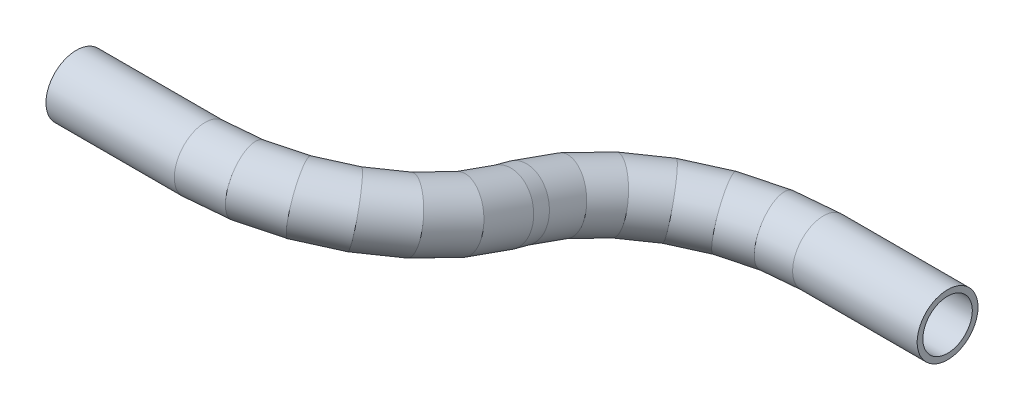
ISO-10303-21;
HEADER;
FILE_DESCRIPTION(('STEP AP214'),'2;1');
FILE_NAME('part.step','',(''),(''),'','','');
FILE_SCHEMA(('AUTOMOTIVE_DESIGN { 1 0 10303 214 1 1 1 1 }'));
ENDSEC;
DATA;
#1=APPLICATION_CONTEXT('core data for automotive mechanical design processes');
#2=APPLICATION_PROTOCOL_DEFINITION('international standard','automotive_design',2000,#1);
#3=PRODUCT_CONTEXT('',#1,'mechanical');
#4=PRODUCT('Part','Part','',(#3));
#5=PRODUCT_RELATED_PRODUCT_CATEGORY('part','',(#4));
#6=PRODUCT_DEFINITION_FORMATION('','',#4);
#7=PRODUCT_DEFINITION_CONTEXT('part definition',#1,'design');
#8=PRODUCT_DEFINITION('design','',#6,#7);
#9=PRODUCT_DEFINITION_SHAPE('','',#8);
#10=(LENGTH_UNIT() NAMED_UNIT(*) SI_UNIT(.MILLI.,.METRE.));
#11=(NAMED_UNIT(*) PLANE_ANGLE_UNIT() SI_UNIT($,.RADIAN.));
#12=(NAMED_UNIT(*) SI_UNIT($,.STERADIAN.) SOLID_ANGLE_UNIT());
#13=UNCERTAINTY_MEASURE_WITH_UNIT(LENGTH_MEASURE(1.E-05),#10,'distance_accuracy_value','');
#14=(GEOMETRIC_REPRESENTATION_CONTEXT(3) GLOBAL_UNCERTAINTY_ASSIGNED_CONTEXT((#13)) GLOBAL_UNIT_ASSIGNED_CONTEXT((#10,
#11,#12)) REPRESENTATION_CONTEXT('',''));
#15=CARTESIAN_POINT('',(0.,0.,0.));
#16=DIRECTION('',(0.,0.,1.));
#17=DIRECTION('',(1.,0.,0.));
#18=AXIS2_PLACEMENT_3D('',#15,#16,#17);
#19=CARTESIAN_POINT('',(-2251.19736561347,-22.4007883536229,-83.6008802653181));
#20=DIRECTION('',(1.,0.,0.));
#21=DIRECTION('',(0.,0.,-1.));
#22=AXIS2_PLACEMENT_3D('',#19,#20,#21);
#23=CYLINDRICAL_SURFACE('',#22,4.7625);
#24=CARTESIAN_POINT('',(-2250.58796047896,-22.4007883536228,-83.6008802653177));
#25=DIRECTION('',(0.997858923238603,-0.0169275754540626,-0.0631745716435174));
#26=DIRECTION('',(-0.0654031292301438,-0.258264893659644,-0.963857704949168));
#27=AXIS2_PLACEMENT_3D('',#24,#25,#26);
#28=ELLIPSE('',#27,4.77271875721977,4.7625);
#29=CARTESIAN_POINT('',(-2250.90011122062,-23.6334140559236,-88.2011020130194));
#30=VERTEX_POINT('',#29);
#31=EDGE_CURVE('E45',#30,#30,#28,.F.);
#32=ORIENTED_EDGE('',*,*,#31,.F.);
#33=EDGE_LOOP('',(#32));
#34=FACE_BOUND('',#33,.T.);
#35=CARTESIAN_POINT('',(-2230.78796047896,-22.4007883536229,-83.6008802653181));
#36=DIRECTION('',(1.,0.,0.));
#37=DIRECTION('',(0.,0.,-1.));
#38=AXIS2_PLACEMENT_3D('',#35,#36,#37);
#39=CIRCLE('',#38,4.7625);
#40=CARTESIAN_POINT('',(-2230.78796047896,-22.4007883536229,-88.3633802653181));
#41=VERTEX_POINT('',#40);
#42=EDGE_CURVE('E98',#41,#41,#39,.T.);
#43=ORIENTED_EDGE('',*,*,#42,.F.);
#44=EDGE_LOOP('',(#43));
#45=FACE_BOUND('',#44,.T.);
#46=ADVANCED_FACE('F39',(#34,#45),#23,.T.);
#47=CARTESIAN_POINT('',(-2257.91321428504,-22.1511863829578,-82.6693530291264));
#48=DIRECTION('',(0.99144486137381,-0.0337826644312621,-0.126078620072521));
#49=DIRECTION('',(-0.126150626485885,0.,-0.992011098444578));
#50=AXIS2_PLACEMENT_3D('',#47,#48,#49);
#51=CYLINDRICAL_SURFACE('',#50,4.7625);
#52=CARTESIAN_POINT('',(-2256.79961756142,-22.1891312711623,-82.8109652797932));
#53=DIRECTION('',(0.965925826289069,-0.0669872981077804,-0.249999999999999));
#54=DIRECTION('',(-0.25881904510252,-0.250000000000001,-0.93301270189222));
#55=AXIS2_PLACEMENT_3D('',#52,#53,#54);
#56=ELLIPSE('',#55,4.80359542476298,4.7625);
#57=CARTESIAN_POINT('',(-2258.04287954231,-23.3900301273531,-87.2927808258484));
#58=VERTEX_POINT('',#57);
#59=EDGE_CURVE('E136',#58,#58,#56,.F.);
#60=ORIENTED_EDGE('',*,*,#59,.F.);
#61=EDGE_LOOP('',(#60));
#62=FACE_BOUND('',#61,.T.);
#63=ORIENTED_EDGE('',*,*,#31,.T.);
#64=EDGE_LOOP('',(#63));
#65=FACE_BOUND('',#64,.T.);
#66=ADVANCED_FACE('F141',(#62,#65),#51,.T.);
#67=CARTESIAN_POINT('',(-2263.62566742617,-21.4573353209812,-80.0798656129441));
#68=DIRECTION('',(0.923879532511288,-0.0990457605412868,-0.369643810614382));
#69=DIRECTION('',(-0.371470375165562,0.,-0.92844480739264));
#70=AXIS2_PLACEMENT_3D('',#67,#68,#69);
#71=CYLINDRICAL_SURFACE('',#70,4.7625);
#72=CARTESIAN_POINT('',(-2262.58796047896,-21.5685841041705,-80.4950517240874));
#73=DIRECTION('',(0.866025403784444,-0.129409522551258,-0.482962913144526));
#74=DIRECTION('',(-0.499999999999991,-0.224143868042012,-0.836516303737813));
#75=AXIS2_PLACEMENT_3D('',#72,#73,#74);
#76=ELLIPSE('',#75,4.80359542476298,4.7625);
#77=CARTESIAN_POINT('',(-2264.98975819134,-22.6452805631858,-84.513337613462));
#78=VERTEX_POINT('',#77);
#79=EDGE_CURVE('E131',#78,#78,#76,.F.);
#80=ORIENTED_EDGE('',*,*,#79,.F.);
#81=EDGE_LOOP('',(#80));
#82=FACE_BOUND('',#81,.T.);
#83=ORIENTED_EDGE('',*,*,#59,.T.);
#84=EDGE_LOOP('',(#83));
#85=FACE_BOUND('',#84,.T.);
#86=ADVANCED_FACE('F428',(#82,#85),#71,.T.);
#87=CARTESIAN_POINT('',(-2268.44962238468,-20.4044648591282,-76.1504995555207));
#88=DIRECTION('',(0.793353340291245,-0.157559051751279,-0.58801838632815));
#89=DIRECTION('',(-0.595455888114244,0.,-0.803388004210965));
#90=AXIS2_PLACEMENT_3D('',#87,#88,#89);
#91=CYLINDRICAL_SURFACE('',#90,4.7625);
#92=CARTESIAN_POINT('',(-2267.55852322743,-20.5814361165757,-76.8109652797938));
#93=DIRECTION('',(0.70710678118655,-0.183012701892218,-0.683012701892217));
#94=DIRECTION('',(-0.707106781186545,-0.183012701892222,-0.683012701892221));
#95=AXIS2_PLACEMENT_3D('',#92,#93,#94);
#96=ELLIPSE('',#95,4.80359542476299,4.7625);
#97=CARTESIAN_POINT('',(-2270.95517812636,-21.4605550940587,-80.0918819696583));
#98=VERTEX_POINT('',#97);
#99=EDGE_CURVE('E132',#98,#98,#96,.F.);
#100=ORIENTED_EDGE('',*,*,#99,.F.);
#101=EDGE_LOOP('',(#100));
#102=FACE_BOUND('',#101,.T.);
#103=ORIENTED_EDGE('',*,*,#79,.T.);
#104=EDGE_LOOP('',(#103));
#105=FACE_BOUND('',#104,.T.);
#106=ADVANCED_FACE('F420',(#102,#105),#91,.T.);
#107=CARTESIAN_POINT('',(-2272.0563346021,-19.0643263794237,-71.1490346600851));
#108=DIRECTION('',(0.608761429008714,-0.205334953963074,-0.766320480760009));
#109=DIRECTION('',(-0.783004939700822,0.,-0.622015485662626));
#110=AXIS2_PLACEMENT_3D('',#107,#108,#109);
#111=CYLINDRICAL_SURFACE('',#110,4.7625);
#112=CARTESIAN_POINT('',(-2271.37257016978,-19.2949598123929,-72.0097703498494));
#113=DIRECTION('',(0.499999999999995,-0.224143868042014,-0.836516303737811));
#114=DIRECTION('',(-0.866025403784442,-0.129409522551256,-0.48296291314453));
#115=AXIS2_PLACEMENT_3D('',#112,#113,#114);
#116=ELLIPSE('',#115,4.80359542476298,4.7625);
#117=CARTESIAN_POINT('',(-2275.53260583713,-19.9165908028409,-74.3297287897607));
#118=VERTEX_POINT('',#117);
#119=EDGE_CURVE('E126',#118,#118,#116,.F.);
#120=ORIENTED_EDGE('',*,*,#119,.F.);
#121=EDGE_LOOP('',(#120));
#122=FACE_BOUND('',#121,.T.);
#123=ORIENTED_EDGE('',*,*,#99,.T.);
#124=EDGE_LOOP('',(#123));
#125=FACE_BOUND('',#124,.T.);
#126=ADVANCED_FACE('F408',(#122,#125),#111,.T.);
#127=CARTESIAN_POINT('',(-2274.2000126012,-17.528248104576,-65.4163124939497));
#128=DIRECTION('',(0.382683432365087,-0.239117618394335,-0.892399100832524));
#129=DIRECTION('',(-0.919060484937435,0.,-0.394116511994317));
#130=AXIS2_PLACEMENT_3D('',#127,#128,#129);
#131=CYLINDRICAL_SURFACE('',#130,4.7625);
#132=CARTESIAN_POINT('',(-2273.7701803099,-17.796826425749,-66.4186604343813));
#133=DIRECTION('',(0.258819045102515,-0.25,-0.933012701892221));
#134=DIRECTION('',(-0.96592582628907,-0.0669872981077814,-0.249999999999994));
#135=AXIS2_PLACEMENT_3D('',#132,#133,#134);
#136=ELLIPSE('',#135,4.80359542476298,4.7625);
#137=CARTESIAN_POINT('',(-2278.41009718972,-18.1186063044568,-67.619559290572));
#138=VERTEX_POINT('',#137);
#139=EDGE_CURVE('E124',#138,#138,#136,.F.);
#140=ORIENTED_EDGE('',*,*,#139,.F.);
#141=EDGE_LOOP('',(#140));
#142=FACE_BOUND('',#141,.T.);
#143=ORIENTED_EDGE('',*,*,#119,.T.);
#144=EDGE_LOOP('',(#143));
#145=FACE_BOUND('',#144,.T.);
#146=ADVANCED_FACE('F402',(#142,#145),#131,.T.);
#147=CARTESIAN_POINT('',(-2274.66750381069,-16.0327549810104,-59.8350561744354));
#148=DIRECTION('',(0.130526192220043,-0.256604812292571,-0.95766219694255));
#149=DIRECTION('',(0.,0.965925826289068,-0.258819045102521));
#150=AXIS2_PLACEMENT_3D('',#147,#148,#149);
#151=CYLINDRICAL_SURFACE('',#150,4.7625);
#152=CARTESIAN_POINT('',(-2274.58796047896,-16.1891312711625,-60.4186604343812));
#153=DIRECTION('',(0.065403129230139,-0.258264893659645,-0.963857704949168));
#154=DIRECTION('',(-0.997858923238604,-0.016927575454049,-0.063174571643516));
#155=AXIS2_PLACEMENT_3D('',#152,#153,#154);
#156=ELLIPSE('',#155,4.77271875721977,4.7625);
#157=CARTESIAN_POINT('',(-2279.35046047896,-16.2699218280463,-60.7201748974436));
#158=VERTEX_POINT('',#157);
#159=EDGE_CURVE('E125',#158,#158,#156,.F.);
#160=ORIENTED_EDGE('',*,*,#159,.F.);
#161=EDGE_LOOP('',(#160));
#162=FACE_BOUND('',#161,.T.);
#163=ORIENTED_EDGE('',*,*,#139,.T.);
#164=EDGE_LOOP('',(#163));
#165=FACE_BOUND('',#164,.T.);
#166=ADVANCED_FACE('F395',(#162,#165),#151,.T.);
#167=CARTESIAN_POINT('',(-2274.58796047896,-15.3714170511557,-57.3669094192444));
#168=DIRECTION('',(0.,-0.258819045102519,-0.965925826289069));
#169=DIRECTION('',(0.,0.965925826289069,-0.258819045102519));
#170=AXIS2_PLACEMENT_3D('',#167,#168,#169);
#171=CYLINDRICAL_SURFACE('',#170,4.7625);
#172=CARTESIAN_POINT('',(-2274.58796047896,-15.5291427061513,-57.9555495773441));
#173=DIRECTION('',(0.065403129230104,-0.258264893659645,-0.963857704949171));
#174=DIRECTION('',(0.997858923238606,0.0169275754540436,0.0631745716434813));
#175=AXIS2_PLACEMENT_3D('',#172,#173,#174);
#176=ELLIPSE('',#175,4.77271875721976,4.7625);
#177=CARTESIAN_POINT('',(-2269.82546047896,-15.4483521492675,-57.6540351142819));
#178=VERTEX_POINT('',#177);
#179=EDGE_CURVE('E116',#178,#178,#176,.F.);
#180=ORIENTED_EDGE('',*,*,#179,.F.);
#181=EDGE_LOOP('',(#180));
#182=FACE_BOUND('',#181,.T.);
#183=ORIENTED_EDGE('',*,*,#159,.T.);
#184=EDGE_LOOP('',(#183));
#185=FACE_BOUND('',#184,.T.);
#186=ADVANCED_FACE('F382',(#182,#185),#171,.T.);
#187=CARTESIAN_POINT('',(-2275.55234843799,-13.6332275109274,-50.8798977419267));
#188=DIRECTION('',(0.130526192219974,-0.256604812292573,-0.957662196942558));
#189=DIRECTION('',(0.,0.965925826289068,-0.258819045102521));
#190=AXIS2_PLACEMENT_3D('',#187,#188,#189);
#191=CYLINDRICAL_SURFACE('',#190,4.7625);
#192=CARTESIAN_POINT('',(-2275.40574064802,-13.9214475515643,-51.9555495773442));
#193=DIRECTION('',(0.258819045102513,-0.250000000000001,-0.933012701892222));
#194=DIRECTION('',(0.965925826289071,0.0669872981077778,0.249999999999992));
#195=AXIS2_PLACEMENT_3D('',#192,#193,#194);
#196=ELLIPSE('',#195,4.80359542476302,4.7625);
#197=CARTESIAN_POINT('',(-2270.7658237682,-13.5996676728566,-50.7546507211535));
#198=VERTEX_POINT('',#197);
#199=EDGE_CURVE('E117',#198,#198,#196,.F.);
#200=ORIENTED_EDGE('',*,*,#199,.F.);
#201=EDGE_LOOP('',(#200));
#202=FACE_BOUND('',#201,.T.);
#203=ORIENTED_EDGE('',*,*,#179,.T.);
#204=EDGE_LOOP('',(#203));
#205=FACE_BOUND('',#204,.T.);
#206=ADVANCED_FACE('F372',(#202,#205),#191,.T.);
#207=CARTESIAN_POINT('',(-2278.23318307944,-12.1547358437474,-45.3620917214446));
#208=DIRECTION('',(0.382683432365147,-0.239117618394329,-0.8923991008325));
#209=DIRECTION('',(-0.919060484937409,0.,-0.394116511994378));
#210=AXIS2_PLACEMENT_3D('',#207,#208,#209);
#211=CYLINDRICAL_SURFACE('',#210,4.7625);
#212=CARTESIAN_POINT('',(-2277.80335078813,-12.4233141649209,-46.3644396618756));
#213=DIRECTION('',(0.500000000000023,-0.22414386804201,-0.836516303737795));
#214=DIRECTION('',(0.866025403784425,0.129409522551268,0.482962913144556));
#215=AXIS2_PLACEMENT_3D('',#212,#213,#214);
#216=ELLIPSE('',#215,4.80359542476296,4.7625);
#217=CARTESIAN_POINT('',(-2273.64331512078,-11.8016831744729,-44.0444812219642));
#218=VERTEX_POINT('',#217);
#219=EDGE_CURVE('E114',#218,#218,#216,.F.);
#220=ORIENTED_EDGE('',*,*,#219,.F.);
#221=EDGE_LOOP('',(#220));
#222=FACE_BOUND('',#221,.T.);
#223=ORIENTED_EDGE('',*,*,#199,.T.);
#224=EDGE_LOOP('',(#223));
#225=FACE_BOUND('',#224,.T.);
#226=ADVANCED_FACE('F364',(#222,#225),#211,.T.);
#227=CARTESIAN_POINT('',(-2282.3011621628,-10.9062044277689,-40.7025090421669));
#228=DIRECTION('',(0.608761429008714,-0.205334953963074,-0.766320480760009));
#229=DIRECTION('',(-0.783004939700822,0.,-0.622015485662626));
#230=AXIS2_PLACEMENT_3D('',#227,#228,#229);
#231=CYLINDRICAL_SURFACE('',#230,4.7625);
#232=CARTESIAN_POINT('',(-2281.61739773048,-11.1368378607379,-41.5632447319311));
#233=DIRECTION('',(0.70710678118655,-0.183012701892219,-0.683012701892217));
#234=DIRECTION('',(0.707106781186545,0.183012701892218,0.683012701892222));
#235=AXIS2_PLACEMENT_3D('',#232,#233,#234);
#236=ELLIPSE('',#235,4.80359542476299,4.7625);
#237=CARTESIAN_POINT('',(-2278.22074283156,-10.2577188832549,-38.2823280420666));
#238=VERTEX_POINT('',#237);
#239=EDGE_CURVE('E109',#238,#238,#236,.F.);
#240=ORIENTED_EDGE('',*,*,#239,.F.);
#241=EDGE_LOOP('',(#240));
#242=FACE_BOUND('',#241,.T.);
#243=ORIENTED_EDGE('',*,*,#219,.T.);
#244=EDGE_LOOP('',(#243));
#245=FACE_BOUND('',#244,.T.);
#246=ADVANCED_FACE('F356',(#242,#245),#231,.T.);
#247=CARTESIAN_POINT('',(-2287.4790596362,-9.97271861569554,-37.2186925633644));
#248=DIRECTION('',(0.793353340291245,-0.15755905175128,-0.58801838632815));
#249=DIRECTION('',(-0.595455888114244,0.,-0.803388004210965));
#250=AXIS2_PLACEMENT_3D('',#247,#248,#249);
#251=CYLINDRICAL_SURFACE('',#250,4.7625);
#252=CARTESIAN_POINT('',(-2286.58796047896,-10.149689873143,-37.8791582876369));
#253=DIRECTION('',(0.866025403784437,-0.129409522551261,-0.482962913144537));
#254=DIRECTION('',(0.500000000000003,0.224143868042014,0.836516303737806));
#255=AXIS2_PLACEMENT_3D('',#252,#253,#254);
#256=ELLIPSE('',#255,4.80359542476297,4.7625);
#257=CARTESIAN_POINT('',(-2284.18616276658,-9.07299341412766,-33.8608723982624));
#258=VERTEX_POINT('',#257);
#259=EDGE_CURVE('E110',#258,#258,#256,.F.);
#260=ORIENTED_EDGE('',*,*,#259,.F.);
#261=EDGE_LOOP('',(#260));
#262=FACE_BOUND('',#261,.T.);
#263=ORIENTED_EDGE('',*,*,#239,.T.);
#264=EDGE_LOOP('',(#263));
#265=FACE_BOUND('',#264,.T.);
#266=ADVANCED_FACE('F350',(#262,#265),#251,.T.);
#267=CARTESIAN_POINT('',(-2293.41401034371,-9.41789392296175,-35.1480586207875));
#268=DIRECTION('',(0.923879532511278,-0.0990457605412928,-0.369643810614406));
#269=DIRECTION('',(-0.371470375165585,0.,-0.928444807392631));
#270=AXIS2_PLACEMENT_3D('',#267,#268,#269);
#271=CYLINDRICAL_SURFACE('',#270,4.7625);
#272=CARTESIAN_POINT('',(-2292.3763033965,-9.52914270615124,-35.5632447319308));
#273=DIRECTION('',(0.965925826289066,-0.0669872981077824,-0.250000000000007));
#274=DIRECTION('',(0.258819045102528,0.25,0.933012701892218));
#275=AXIS2_PLACEMENT_3D('',#272,#273,#274);
#276=ELLIPSE('',#275,4.80359542476299,4.7625);
#277=CARTESIAN_POINT('',(-2291.1330414156,-8.32824384996049,-31.0814291858756));
#278=VERTEX_POINT('',#277);
#279=EDGE_CURVE('E102',#278,#278,#276,.F.);
#280=ORIENTED_EDGE('',*,*,#279,.F.);
#281=EDGE_LOOP('',(#280));
#282=FACE_BOUND('',#281,.T.);
#283=ORIENTED_EDGE('',*,*,#259,.T.);
#284=EDGE_LOOP('',(#283));
#285=FACE_BOUND('',#284,.T.);
#286=ADVANCED_FACE('F339',(#282,#285),#271,.T.);
#287=CARTESIAN_POINT('',(-2299.19215206807,-9.2968982945288,-34.6964967879819));
#288=DIRECTION('',(0.991444861373811,-0.0337826644312598,-0.126078620072512));
#289=DIRECTION('',(-0.126150626485876,0.,-0.992011098444579));
#290=AXIS2_PLACEMENT_3D('',#287,#288,#289);
#291=CYLINDRICAL_SURFACE('',#290,4.7625);
#292=CARTESIAN_POINT('',(-2298.58796047896,-9.31748562369074,-34.7733297464065));
#293=DIRECTION('',(0.997858923238604,-0.0169275754540614,-0.0631745716435129));
#294=DIRECTION('',(0.0654031292301392,0.258264893659645,0.963857704949169));
#295=AXIS2_PLACEMENT_3D('',#292,#293,#294);
#296=ELLIPSE('',#295,4.77271875721977,4.7625);
#297=CARTESIAN_POINT('',(-2298.2758097373,-8.08485992138999,-30.1731079987048));
#298=VERTEX_POINT('',#297);
#299=EDGE_CURVE('E101',#298,#298,#296,.F.);
#300=ORIENTED_EDGE('',*,*,#299,.F.);
#301=EDGE_LOOP('',(#300));
#302=FACE_BOUND('',#301,.T.);
#303=ORIENTED_EDGE('',*,*,#279,.T.);
#304=EDGE_LOOP('',(#303));
#305=FACE_BOUND('',#304,.T.);
#306=ADVANCED_FACE('F165',(#302,#305),#291,.T.);
#307=CARTESIAN_POINT('',(-2318.38796047896,-9.31748562369074,-34.7733297464065));
#308=DIRECTION('',(1.,0.,0.));
#309=DIRECTION('',(0.,0.,-1.));
#310=AXIS2_PLACEMENT_3D('',#307,#308,#309);
#311=CYLINDRICAL_SURFACE('',#310,4.7625);
#312=CARTESIAN_POINT('',(-2318.38796047896,-9.31748562369074,-34.7733297464065));
#313=DIRECTION('',(1.,0.,0.));
#314=DIRECTION('',(0.,0.,-1.));
#315=AXIS2_PLACEMENT_3D('',#312,#313,#314);
#316=CIRCLE('',#315,4.7625);
#317=CARTESIAN_POINT('',(-2318.38796047896,-9.31748562369074,-39.5358297464065));
#318=VERTEX_POINT('',#317);
#319=EDGE_CURVE('E92',#318,#318,#316,.T.);
#320=ORIENTED_EDGE('',*,*,#319,.T.);
#321=EDGE_LOOP('',(#320));
#322=FACE_BOUND('',#321,.T.);
#323=ORIENTED_EDGE('',*,*,#299,.T.);
#324=EDGE_LOOP('',(#323));
#325=FACE_BOUND('',#324,.T.);
#326=ADVANCED_FACE('F155',(#322,#325),#311,.T.);
#327=CARTESIAN_POINT('',(-2230.78796047896,-22.4007883536229,-83.6008802653181));
#328=DIRECTION('',(1.,0.,0.));
#329=DIRECTION('',(0.,0.,-1.));
#330=AXIS2_PLACEMENT_3D('',#327,#328,#329);
#331=PLANE('',#330);
#332=CARTESIAN_POINT('',(-2230.78796047896,-22.4007883536229,-83.6008802653181));
#333=DIRECTION('',(1.,0.,0.));
#334=DIRECTION('',(0.,0.,-1.));
#335=AXIS2_PLACEMENT_3D('',#332,#333,#334);
#336=CIRCLE('',#335,3.8735);
#337=CARTESIAN_POINT('',(-2230.78796047896,-22.4007883536229,-87.4743802653181));
#338=VERTEX_POINT('',#337);
#339=EDGE_CURVE('E95',#338,#338,#336,.F.);
#340=ORIENTED_EDGE('',*,*,#339,.T.);
#341=EDGE_LOOP('',(#340));
#342=FACE_BOUND('',#341,.T.);
#343=ORIENTED_EDGE('',*,*,#42,.T.);
#344=EDGE_LOOP('',(#343));
#345=FACE_BOUND('',#344,.T.);
#346=ADVANCED_FACE('F149',(#342,#345),#331,.T.);
#347=CARTESIAN_POINT('',(-2318.38796047896,-9.31748562369074,-34.7733297464065));
#348=DIRECTION('',(1.,0.,0.));
#349=DIRECTION('',(0.,0.,-1.));
#350=AXIS2_PLACEMENT_3D('',#347,#348,#349);
#351=PLANE('',#350);
#352=CARTESIAN_POINT('',(-2318.38796047896,-9.31748562369074,-34.7733297464065));
#353=DIRECTION('',(1.,0.,0.));
#354=DIRECTION('',(0.,0.,-1.));
#355=AXIS2_PLACEMENT_3D('',#352,#353,#354);
#356=CIRCLE('',#355,3.8735);
#357=CARTESIAN_POINT('',(-2318.38796047896,-9.31748562369074,-38.6468297464065));
#358=VERTEX_POINT('',#357);
#359=EDGE_CURVE('E46',#358,#358,#356,.F.);
#360=ORIENTED_EDGE('',*,*,#359,.F.);
#361=EDGE_LOOP('',(#360));
#362=FACE_BOUND('',#361,.T.);
#363=ORIENTED_EDGE('',*,*,#319,.F.);
#364=EDGE_LOOP('',(#363));
#365=FACE_BOUND('',#364,.T.);
#366=ADVANCED_FACE('F151',(#362,#365),#351,.F.);
#367=CARTESIAN_POINT('',(-2251.10227665503,-22.4007883536229,-83.6008802653181));
#368=DIRECTION('',(1.,0.,0.));
#369=DIRECTION('',(0.,0.,-1.));
#370=AXIS2_PLACEMENT_3D('',#367,#368,#369);
#371=CYLINDRICAL_SURFACE('',#370,3.8735);
#372=CARTESIAN_POINT('',(-2250.58796047896,-22.4007883536229,-83.6008802653177));
#373=DIRECTION('',(0.997858923238603,-0.0169275754540625,-0.0631745716435174));
#374=DIRECTION('',(-0.0654031292301438,-0.258264893659644,-0.963857704949168));
#375=AXIS2_PLACEMENT_3D('',#372,#373,#374);
#376=ELLIPSE('',#375,3.88181125587208,3.8735);
#377=CARTESIAN_POINT('',(-2250.84184308217,-23.4033239248275,-87.3423939534484));
#378=VERTEX_POINT('',#377);
#379=EDGE_CURVE('E90',#378,#378,#376,.T.);
#380=ORIENTED_EDGE('',*,*,#379,.F.);
#381=EDGE_LOOP('',(#380));
#382=FACE_BOUND('',#381,.T.);
#383=ORIENTED_EDGE('',*,*,#339,.F.);
#384=EDGE_LOOP('',(#383));
#385=FACE_BOUND('',#384,.T.);
#386=ADVANCED_FACE('F157',(#382,#385),#371,.F.);
#387=CARTESIAN_POINT('',(-2257.72384986738,-22.1576388190199,-82.6934338483428));
#388=DIRECTION('',(0.99144486137381,-0.0337826644312621,-0.126078620072521));
#389=DIRECTION('',(-0.126150626485885,0.,-0.992011098444578));
#390=AXIS2_PLACEMENT_3D('',#387,#388,#389);
#391=CYLINDRICAL_SURFACE('',#390,3.8735);
#392=CARTESIAN_POINT('',(-2256.79961756142,-22.1891312711623,-82.8109652797931));
#393=DIRECTION('',(0.965925826289069,-0.0669872981077804,-0.249999999999999));
#394=DIRECTION('',(-0.258819045102519,-0.250000000000001,-0.93301270189222));
#395=AXIS2_PLACEMENT_3D('',#392,#393,#394);
#396=ELLIPSE('',#395,3.90692427880722,3.8735);
#397=CARTESIAN_POINT('',(-2257.81080397255,-23.1658623408641,-86.4561752572513));
#398=VERTEX_POINT('',#397);
#399=EDGE_CURVE('E88',#398,#398,#396,.T.);
#400=ORIENTED_EDGE('',*,*,#399,.F.);
#401=EDGE_LOOP('',(#400));
#402=FACE_BOUND('',#401,.T.);
#403=ORIENTED_EDGE('',*,*,#379,.T.);
#404=EDGE_LOOP('',(#403));
#405=FACE_BOUND('',#404,.T.);
#406=ADVANCED_FACE('F218',(#402,#405),#391,.F.);
#407=CARTESIAN_POINT('',(-2263.44920788063,-21.4762529063131,-80.1504670025592));
#408=DIRECTION('',(0.923879532511288,-0.0990457605412868,-0.369643810614382));
#409=DIRECTION('',(-0.371470375165562,0.,-0.92844480739264));
#410=AXIS2_PLACEMENT_3D('',#407,#408,#409);
#411=CYLINDRICAL_SURFACE('',#410,3.8735);
#412=CARTESIAN_POINT('',(-2262.58796047896,-21.5685841041705,-80.4950517240873));
#413=DIRECTION('',(0.866025403784443,-0.129409522551258,-0.482962913144526));
#414=DIRECTION('',(-0.499999999999992,-0.224143868042012,-0.836516303737813));
#415=AXIS2_PLACEMENT_3D('',#412,#413,#414);
#416=ELLIPSE('',#415,3.90692427880722,3.8735);
#417=CARTESIAN_POINT('',(-2264.54142261836,-22.4442972241696,-83.7632575807786));
#418=VERTEX_POINT('',#417);
#419=EDGE_CURVE('E82',#418,#418,#416,.T.);
#420=ORIENTED_EDGE('',*,*,#419,.F.);
#421=EDGE_LOOP('',(#420));
#422=FACE_BOUND('',#421,.T.);
#423=ORIENTED_EDGE('',*,*,#399,.T.);
#424=EDGE_LOOP('',(#423));
#425=FACE_BOUND('',#424,.T.);
#426=ADVANCED_FACE('F214',(#422,#425),#411,.F.);
#427=CARTESIAN_POINT('',(-2268.29809313768,-20.4345583915523,-76.2628101475067));
#428=DIRECTION('',(0.793353340291245,-0.157559051751279,-0.588018386328151));
#429=DIRECTION('',(-0.595455888114244,0.,-0.803388004210965));
#430=AXIS2_PLACEMENT_3D('',#427,#428,#429);
#431=CYLINDRICAL_SURFACE('',#430,3.8735);
#432=CARTESIAN_POINT('',(-2267.55852322744,-20.5814361165757,-76.8109652797939));
#433=DIRECTION('',(0.70710678118655,-0.183012701892218,-0.683012701892217));
#434=DIRECTION('',(-0.707106781186545,-0.183012701892222,-0.683012701892221));
#435=AXIS2_PLACEMENT_3D('',#432,#433,#434);
#436=ELLIPSE('',#435,3.90692427880723,3.8735);
#437=CARTESIAN_POINT('',(-2270.32113587856,-21.2964528849286,-79.4794441875504));
#438=VERTEX_POINT('',#437);
#439=EDGE_CURVE('E78',#438,#438,#436,.T.);
#440=ORIENTED_EDGE('',*,*,#439,.F.);
#441=EDGE_LOOP('',(#440));
#442=FACE_BOUND('',#441,.T.);
#443=ORIENTED_EDGE('',*,*,#419,.T.);
#444=EDGE_LOOP('',(#443));
#445=FACE_BOUND('',#444,.T.);
#446=ADVANCED_FACE('F211',(#442,#445),#431,.F.);
#447=CARTESIAN_POINT('',(-2271.94006212141,-19.1035450344373,-71.2954006732003));
#448=DIRECTION('',(0.608761429008714,-0.205334953963074,-0.766320480760009));
#449=DIRECTION('',(-0.783004939700821,0.,-0.622015485662626));
#450=AXIS2_PLACEMENT_3D('',#447,#448,#449);
#451=CYLINDRICAL_SURFACE('',#450,3.8735);
#452=CARTESIAN_POINT('',(-2271.37257016978,-19.294959812393,-72.0097703498495));
#453=DIRECTION('',(0.499999999999995,-0.224143868042014,-0.836516303737811));
#454=DIRECTION('',(-0.866025403784442,-0.129409522551257,-0.48296291314453));
#455=AXIS2_PLACEMENT_3D('',#452,#453,#454);
#456=ELLIPSE('',#455,3.90692427880722,3.8735);
#457=CARTESIAN_POINT('',(-2274.75606584589,-19.8005530179574,-73.8966698809774));
#458=VERTEX_POINT('',#457);
#459=EDGE_CURVE('E80',#458,#458,#456,.T.);
#460=ORIENTED_EDGE('',*,*,#459,.F.);
#461=EDGE_LOOP('',(#460));
#462=FACE_BOUND('',#461,.T.);
#463=ORIENTED_EDGE('',*,*,#439,.T.);
#464=EDGE_LOOP('',(#463));
#465=FACE_BOUND('',#464,.T.);
#466=ADVANCED_FACE('F210',(#462,#465),#451,.F.);
#467=CARTESIAN_POINT('',(-2274.12692066423,-17.5739191956518,-65.5867593262816));
#468=DIRECTION('',(0.382683432365087,-0.239117618394334,-0.892399100832524));
#469=DIRECTION('',(-0.919060484937435,0.,-0.394116511994317));
#470=AXIS2_PLACEMENT_3D('',#467,#468,#469);
#471=CYLINDRICAL_SURFACE('',#470,3.8735);
#472=CARTESIAN_POINT('',(-2273.7701803099,-17.796826425749,-66.4186604343812));
#473=DIRECTION('',(0.258819045102515,-0.25,-0.933012701892221));
#474=DIRECTION('',(-0.96592582628907,-0.0669872981077815,-0.249999999999994));
#475=AXIS2_PLACEMENT_3D('',#472,#473,#474);
#476=ELLIPSE('',#475,3.90692427880723,3.8735);
#477=CARTESIAN_POINT('',(-2277.54397937215,-18.058540727098,-67.395391504083));
#478=VERTEX_POINT('',#477);
#479=EDGE_CURVE('E74',#478,#478,#476,.T.);
#480=ORIENTED_EDGE('',*,*,#479,.F.);
#481=EDGE_LOOP('',(#480));
#482=FACE_BOUND('',#481,.T.);
#483=ORIENTED_EDGE('',*,*,#459,.T.);
#484=EDGE_LOOP('',(#483));
#485=FACE_BOUND('',#484,.T.);
#486=ADVANCED_FACE('F201',(#482,#485),#471,.F.);
#487=CARTESIAN_POINT('',(-2274.65509221102,-16.0571552653427,-59.9261192752825));
#488=DIRECTION('',(0.130526192220043,-0.256604812292571,-0.95766219694255));
#489=DIRECTION('',(0.,0.965925826289068,-0.258819045102521));
#490=AXIS2_PLACEMENT_3D('',#487,#488,#489);
#491=CYLINDRICAL_SURFACE('',#490,3.8735);
#492=CARTESIAN_POINT('',(-2274.58796047896,-16.1891312711625,-60.4186604343812));
#493=DIRECTION('',(0.065403129230139,-0.258264893659644,-0.963857704949168));
#494=DIRECTION('',(-0.997858923238604,-0.0169275754540502,-0.0631745716435157));
#495=AXIS2_PLACEMENT_3D('',#492,#493,#494);
#496=ELLIPSE('',#495,3.88181125587208,3.8735);
#497=CARTESIAN_POINT('',(-2278.46146047896,-16.2548409240947,-60.6638921976719));
#498=VERTEX_POINT('',#497);
#499=EDGE_CURVE('E72',#498,#498,#496,.T.);
#500=ORIENTED_EDGE('',*,*,#499,.F.);
#501=EDGE_LOOP('',(#500));
#502=FACE_BOUND('',#501,.T.);
#503=ORIENTED_EDGE('',*,*,#479,.T.);
#504=EDGE_LOOP('',(#503));
#505=FACE_BOUND('',#504,.T.);
#506=ADVANCED_FACE('F200',(#502,#505),#491,.F.);
#507=CARTESIAN_POINT('',(-2274.58796047896,-15.3960278845797,-57.4587582999992));
#508=DIRECTION('',(0.,-0.258819045102519,-0.965925826289069));
#509=DIRECTION('',(0.,0.965925826289069,-0.258819045102519));
#510=AXIS2_PLACEMENT_3D('',#507,#508,#509);
#511=CYLINDRICAL_SURFACE('',#510,3.8735);
#512=CARTESIAN_POINT('',(-2274.58796047896,-15.5291427061511,-57.9555495773441));
#513=DIRECTION('',(0.065403129230104,-0.258264893659645,-0.963857704949171));
#514=DIRECTION('',(0.997858923238606,0.0169275754540432,0.0631745716434814));
#515=AXIS2_PLACEMENT_3D('',#512,#513,#514);
#516=ELLIPSE('',#515,3.88181125587207,3.8735);
#517=CARTESIAN_POINT('',(-2270.71446047896,-15.463433053219,-57.7103178140535));
#518=VERTEX_POINT('',#517);
#519=EDGE_CURVE('E67',#518,#518,#516,.T.);
#520=ORIENTED_EDGE('',*,*,#519,.F.);
#521=EDGE_LOOP('',(#520));
#522=FACE_BOUND('',#521,.T.);
#523=ORIENTED_EDGE('',*,*,#499,.T.);
#524=EDGE_LOOP('',(#523));
#525=FACE_BOUND('',#524,.T.);
#526=ADVANCED_FACE('F194',(#522,#525),#511,.F.);
#527=CARTESIAN_POINT('',(-2275.52741813945,-13.6822386286836,-51.0628097235291));
#528=DIRECTION('',(0.130526192219974,-0.256604812292573,-0.957662196942558));
#529=DIRECTION('',(0.,0.965925826289068,-0.258819045102521));
#530=AXIS2_PLACEMENT_3D('',#527,#528,#529);
#531=CYLINDRICAL_SURFACE('',#530,3.8735);
#532=CARTESIAN_POINT('',(-2275.40574064802,-13.9214475515643,-51.9555495773442));
#533=DIRECTION('',(0.258819045102513,-0.25,-0.933012701892222));
#534=DIRECTION('',(0.965925826289071,0.0669872981077769,0.249999999999993));
#535=AXIS2_PLACEMENT_3D('',#532,#533,#534);
#536=ELLIPSE('',#535,3.90692427880726,3.8735);
#537=CARTESIAN_POINT('',(-2271.63194158576,-13.6597332502153,-50.9788185076424));
#538=VERTEX_POINT('',#537);
#539=EDGE_CURVE('E63',#538,#538,#536,.T.);
#540=ORIENTED_EDGE('',*,*,#539,.F.);
#541=EDGE_LOOP('',(#540));
#542=FACE_BOUND('',#541,.T.);
#543=ORIENTED_EDGE('',*,*,#519,.T.);
#544=EDGE_LOOP('',(#543));
#545=FACE_BOUND('',#544,.T.);
#546=ADVANCED_FACE('F191',(#542,#545),#531,.F.);
#547=CARTESIAN_POINT('',(-2278.16009114246,-12.2004069348231,-45.5325385537764));
#548=DIRECTION('',(0.382683432365147,-0.239117618394329,-0.8923991008325));
#549=DIRECTION('',(-0.919060484937409,0.,-0.394116511994378));
#550=AXIS2_PLACEMENT_3D('',#547,#548,#549);
#551=CYLINDRICAL_SURFACE('',#550,3.8735);
#552=CARTESIAN_POINT('',(-2277.80335078813,-12.4233141649209,-46.3644396618756));
#553=DIRECTION('',(0.500000000000023,-0.22414386804201,-0.836516303737795));
#554=DIRECTION('',(0.866025403784425,0.129409522551268,0.482962913144556));
#555=AXIS2_PLACEMENT_3D('',#552,#553,#554);
#556=ELLIPSE('',#555,3.90692427880721,3.8735);
#557=CARTESIAN_POINT('',(-2274.41985511202,-11.9177209593565,-44.4775401307477));
#558=VERTEX_POINT('',#557);
#559=EDGE_CURVE('E65',#558,#558,#556,.T.);
#560=ORIENTED_EDGE('',*,*,#559,.F.);
#561=EDGE_LOOP('',(#560));
#562=FACE_BOUND('',#561,.T.);
#563=ORIENTED_EDGE('',*,*,#539,.T.);
#564=EDGE_LOOP('',(#563));
#565=FACE_BOUND('',#564,.T.);
#566=ADVANCED_FACE('F190',(#562,#565),#551,.F.);
#567=CARTESIAN_POINT('',(-2282.18488968211,-10.9454230827825,-40.8488750552822));
#568=DIRECTION('',(0.608761429008714,-0.205334953963074,-0.766320480760009));
#569=DIRECTION('',(-0.783004939700821,0.,-0.622015485662626));
#570=AXIS2_PLACEMENT_3D('',#567,#568,#569);
#571=CYLINDRICAL_SURFACE('',#570,3.8735);
#572=CARTESIAN_POINT('',(-2281.61739773048,-11.1368378607378,-41.563244731931));
#573=DIRECTION('',(0.70710678118655,-0.183012701892219,-0.683012701892217));
#574=DIRECTION('',(0.707106781186545,0.183012701892218,0.683012701892222));
#575=AXIS2_PLACEMENT_3D('',#572,#573,#574);
#576=ELLIPSE('',#575,3.90692427880723,3.8735);
#577=CARTESIAN_POINT('',(-2278.85478507935,-10.421821092385,-38.8947658241745));
#578=VERTEX_POINT('',#577);
#579=EDGE_CURVE('E56',#578,#578,#576,.T.);
#580=ORIENTED_EDGE('',*,*,#579,.F.);
#581=EDGE_LOOP('',(#580));
#582=FACE_BOUND('',#581,.T.);
#583=ORIENTED_EDGE('',*,*,#559,.T.);
#584=EDGE_LOOP('',(#583));
#585=FACE_BOUND('',#584,.T.);
#586=ADVANCED_FACE('F181',(#582,#585),#571,.F.);
#587=CARTESIAN_POINT('',(-2287.3275303892,-10.0028121481197,-37.3310031553504));
#588=DIRECTION('',(0.793353340291245,-0.15755905175128,-0.58801838632815));
#589=DIRECTION('',(-0.595455888114244,0.,-0.803388004210965));
#590=AXIS2_PLACEMENT_3D('',#587,#588,#589);
#591=CYLINDRICAL_SURFACE('',#590,3.8735);
#592=CARTESIAN_POINT('',(-2286.58796047896,-10.1496898731429,-37.879158287637));
#593=DIRECTION('',(0.866025403784437,-0.129409522551261,-0.482962913144537));
#594=DIRECTION('',(0.500000000000003,0.224143868042014,0.836516303737806));
#595=AXIS2_PLACEMENT_3D('',#592,#593,#594);
#596=ELLIPSE('',#595,3.90692427880721,3.8735);
#597=CARTESIAN_POINT('',(-2284.63449833956,-9.27397675314384,-34.6109524309457));
#598=VERTEX_POINT('',#597);
#599=EDGE_CURVE('E57',#598,#598,#596,.T.);
#600=ORIENTED_EDGE('',*,*,#599,.F.);
#601=EDGE_LOOP('',(#600));
#602=FACE_BOUND('',#601,.T.);
#603=ORIENTED_EDGE('',*,*,#579,.T.);
#604=EDGE_LOOP('',(#603));
#605=FACE_BOUND('',#604,.T.);
#606=ADVANCED_FACE('F178',(#602,#605),#591,.F.);
#607=CARTESIAN_POINT('',(-2293.23755079817,-9.4368115082937,-35.218660010403));
#608=DIRECTION('',(0.923879532511278,-0.0990457605412928,-0.369643810614406));
#609=DIRECTION('',(-0.371470375165585,0.,-0.928444807392631));
#610=AXIS2_PLACEMENT_3D('',#607,#608,#609);
#611=CYLINDRICAL_SURFACE('',#610,3.8735);
#612=CARTESIAN_POINT('',(-2292.3763033965,-9.52914270615124,-35.5632447319308));
#613=DIRECTION('',(0.965925826289067,-0.0669872981077824,-0.250000000000007));
#614=DIRECTION('',(0.258819045102528,0.25,0.933012701892218));
#615=AXIS2_PLACEMENT_3D('',#612,#613,#614);
#616=ELLIPSE('',#615,3.90692427880723,3.8735);
#617=CARTESIAN_POINT('',(-2291.36511698537,-8.55241163644944,-31.9180347544725));
#618=VERTEX_POINT('',#617);
#619=EDGE_CURVE('E51',#618,#618,#616,.T.);
#620=ORIENTED_EDGE('',*,*,#619,.F.);
#621=EDGE_LOOP('',(#620));
#622=FACE_BOUND('',#621,.T.);
#623=ORIENTED_EDGE('',*,*,#599,.T.);
#624=EDGE_LOOP('',(#623));
#625=FACE_BOUND('',#624,.T.);
#626=ADVANCED_FACE('F174',(#622,#625),#611,.F.);
#627=CARTESIAN_POINT('',(-2299.09787660885,-9.30011065290298,-34.7084854726464));
#628=DIRECTION('',(0.991444861373811,-0.0337826644312598,-0.126078620072512));
#629=DIRECTION('',(-0.126150626485876,0.,-0.992011098444579));
#630=AXIS2_PLACEMENT_3D('',#627,#628,#629);
#631=CYLINDRICAL_SURFACE('',#630,3.8735);
#632=CARTESIAN_POINT('',(-2298.58796047896,-9.31748562369074,-34.7733297464065));
#633=DIRECTION('',(0.997858923238604,-0.0169275754540614,-0.0631745716435129));
#634=DIRECTION('',(0.0654031292301392,0.258264893659644,0.963857704949168));
#635=AXIS2_PLACEMENT_3D('',#632,#633,#634);
#636=ELLIPSE('',#635,3.88181125587208,3.8735);
#637=CARTESIAN_POINT('',(-2298.33407787574,-8.31495005248613,-31.0318160582758));
#638=VERTEX_POINT('',#637);
#639=EDGE_CURVE('E10',#638,#638,#636,.T.);
#640=ORIENTED_EDGE('',*,*,#639,.F.);
#641=EDGE_LOOP('',(#640));
#642=FACE_BOUND('',#641,.T.);
#643=ORIENTED_EDGE('',*,*,#619,.T.);
#644=EDGE_LOOP('',(#643));
#645=FACE_BOUND('',#644,.T.);
#646=ADVANCED_FACE('F170',(#642,#645),#631,.F.);
#647=CARTESIAN_POINT('',(-2318.38796047896,-9.31748562369074,-34.7733297464065));
#648=DIRECTION('',(1.,0.,0.));
#649=DIRECTION('',(0.,0.,-1.));
#650=AXIS2_PLACEMENT_3D('',#647,#648,#649);
#651=CYLINDRICAL_SURFACE('',#650,3.8735);
#652=ORIENTED_EDGE('',*,*,#359,.T.);
#653=EDGE_LOOP('',(#652));
#654=FACE_BOUND('',#653,.T.);
#655=ORIENTED_EDGE('',*,*,#639,.T.);
#656=EDGE_LOOP('',(#655));
#657=FACE_BOUND('',#656,.T.);
#658=ADVANCED_FACE('F164',(#654,#657),#651,.F.);
#659=CLOSED_SHELL('',(#46,#66,#86,#106,#126,#146,#166,#186,#206,#226,#246,#266,#286,#306,#326,
#346,#366,#386,#406,#426,#446,#466,#486,#506,#526,#546,#566,#586,#606,#626,#646,#658));
#660=MANIFOLD_SOLID_BREP('B2',#659);
#661=ADVANCED_BREP_SHAPE_REPRESENTATION('',(#18,#660),#14);
#662=SHAPE_DEFINITION_REPRESENTATION(#9,#661);
ENDSEC;
END-ISO-10303-21;
